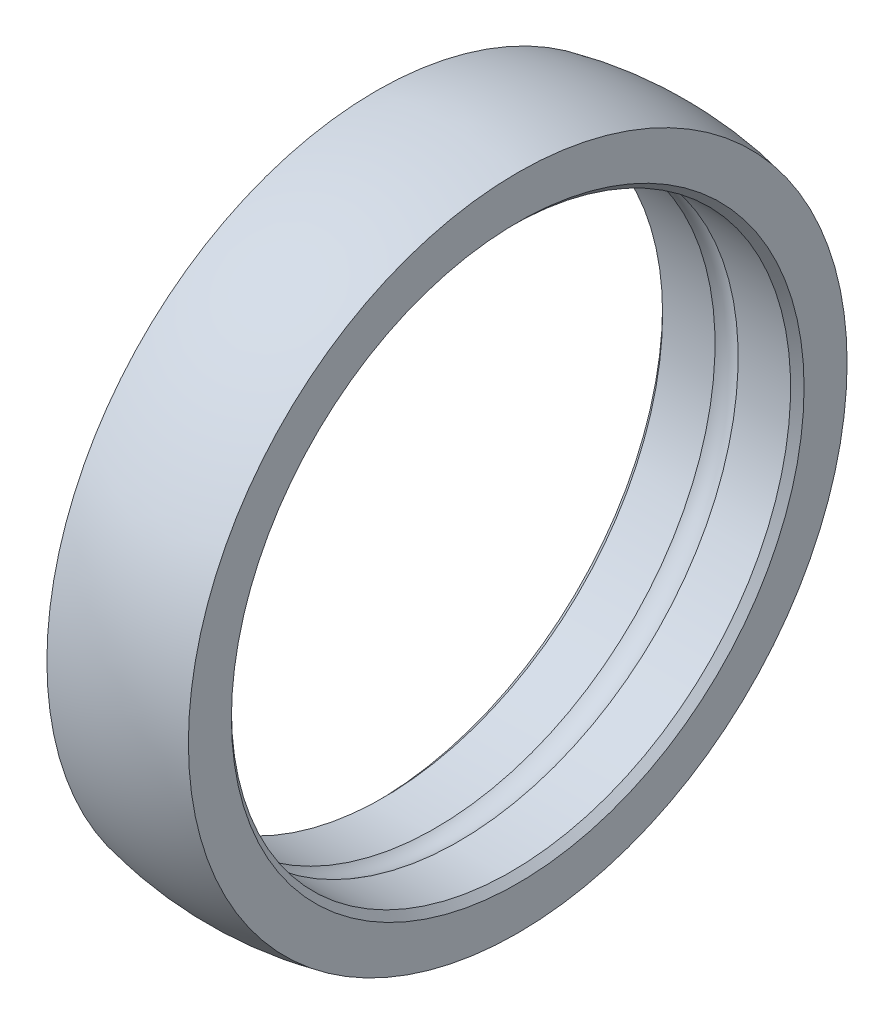
ISO-10303-21;
HEADER;
FILE_DESCRIPTION(('STEP AP214'),'2;1');
FILE_NAME('part.step','',(''),(''),'','','');
FILE_SCHEMA(('AUTOMOTIVE_DESIGN { 1 0 10303 214 1 1 1 1 }'));
ENDSEC;
DATA;
#1=APPLICATION_CONTEXT('core data for automotive mechanical design processes');
#2=APPLICATION_PROTOCOL_DEFINITION('international standard','automotive_design',2000,#1);
#3=PRODUCT_CONTEXT('',#1,'mechanical');
#4=PRODUCT('Part','Part','',(#3));
#5=PRODUCT_RELATED_PRODUCT_CATEGORY('part','',(#4));
#6=PRODUCT_DEFINITION_FORMATION('','',#4);
#7=PRODUCT_DEFINITION_CONTEXT('part definition',#1,'design');
#8=PRODUCT_DEFINITION('design','',#6,#7);
#9=PRODUCT_DEFINITION_SHAPE('','',#8);
#10=(LENGTH_UNIT() NAMED_UNIT(*) SI_UNIT(.MILLI.,.METRE.));
#11=(NAMED_UNIT(*) PLANE_ANGLE_UNIT() SI_UNIT($,.RADIAN.));
#12=(NAMED_UNIT(*) SI_UNIT($,.STERADIAN.) SOLID_ANGLE_UNIT());
#13=UNCERTAINTY_MEASURE_WITH_UNIT(LENGTH_MEASURE(1.E-05),#10,'distance_accuracy_value','');
#14=(GEOMETRIC_REPRESENTATION_CONTEXT(3) GLOBAL_UNCERTAINTY_ASSIGNED_CONTEXT((#13)) GLOBAL_UNIT_ASSIGNED_CONTEXT((#10,
#11,#12)) REPRESENTATION_CONTEXT('',''));
#15=CARTESIAN_POINT('',(0.,0.,0.));
#16=DIRECTION('',(0.,0.,1.));
#17=DIRECTION('',(1.,0.,0.));
#18=AXIS2_PLACEMENT_3D('',#15,#16,#17);
#19=CARTESIAN_POINT('',(0.,0.,0.));
#20=DIRECTION('',(-1.,0.,0.));
#21=DIRECTION('',(0.,1.,0.));
#22=AXIS2_PLACEMENT_3D('',#19,#20,#21);
#23=SPHERICAL_SURFACE('',#22,50.);
#24=CARTESIAN_POINT('',(-10.5,0.,0.));
#25=DIRECTION('',(-1.,0.,0.));
#26=DIRECTION('',(0.,0.,1.));
#27=AXIS2_PLACEMENT_3D('',#24,#25,#26);
#28=CIRCLE('',#27,48.8850692952357);
#29=CARTESIAN_POINT('',(-10.5,48.8850692952357,0.));
#30=VERTEX_POINT('',#29);
#31=EDGE_CURVE('E50',#30,#30,#28,.T.);
#32=CARTESIAN_POINT('',(10.5,0.,0.));
#33=DIRECTION('',(-1.,0.,0.));
#34=DIRECTION('',(0.,0.,1.));
#35=AXIS2_PLACEMENT_3D('',#32,#33,#34);
#36=CIRCLE('',#35,48.8850692952357);
#37=CARTESIAN_POINT('',(10.5,48.8850692952357,0.));
#38=VERTEX_POINT('',#37);
#39=EDGE_CURVE('E59',#38,#38,#36,.T.);
#40=CARTESIAN_POINT('',(-10.5,48.8850692952357,0.));
#41=CARTESIAN_POINT('',(-10.2845238395484,48.9313514073831,0.));
#42=CARTESIAN_POINT('',(-10.0687416397502,48.9762086757729,0.));
#43=CARTESIAN_POINT('',(-9.63660297161498,49.063066075458,0.));
#44=CARTESIAN_POINT('',(-9.42024650327802,49.1050662067534,0.));
#45=CARTESIAN_POINT('',(-8.98699710822005,49.1862018826703,0.));
#46=CARTESIAN_POINT('',(-8.77010418149905,49.2253374272918,0.));
#47=CARTESIAN_POINT('',(-8.33581980053706,49.3007371150384,0.));
#48=CARTESIAN_POINT('',(-8.11842834629607,49.3370012581633,0.));
#49=CARTESIAN_POINT('',(-7.68318492111956,49.406651794309,0.));
#50=CARTESIAN_POINT('',(-7.46533295018404,49.4400381873297,0.));
#51=CARTESIAN_POINT('',(-7.02920658490012,49.5039273874636,0.));
#52=CARTESIAN_POINT('',(-6.81093219055172,49.534430194577,0.));
#53=CARTESIAN_POINT('',(-6.37399914506965,49.5925468887324,0.));
#54=CARTESIAN_POINT('',(-6.15534049393597,49.6201607757745,0.));
#55=CARTESIAN_POINT('',(-5.71767716883949,49.6724948014605,0.));
#56=CARTESIAN_POINT('',(-5.49867249487669,49.6972149401044,0.));
#57=CARTESIAN_POINT('',(-5.06035541854536,49.7437571464735,0.));
#58=CARTESIAN_POINT('',(-4.84104301617683,49.7655792141987,0.));
#59=CARTESIAN_POINT('',(-4.40214883127578,49.8063214630064,0.));
#60=CARTESIAN_POINT('',(-4.18256704874326,49.8252416440888,0.));
#61=CARTESIAN_POINT('',(-3.74317249885619,49.8601768112882,0.));
#62=CARTESIAN_POINT('',(-3.52335973150165,49.876191797405,0.));
#63=CARTESIAN_POINT('',(-3.08354164770247,49.9053137743465,0.));
#64=CARTESIAN_POINT('',(-2.86353633125785,49.918420765171,0.));
#65=CARTESIAN_POINT('',(-2.42337161867875,49.9417244596828,0.));
#66=CARTESIAN_POINT('',(-2.20321222254427,49.9519211633699,0.));
#67=CARTESIAN_POINT('',(-1.76277784692764,49.9694025006451,0.));
#68=CARTESIAN_POINT('',(-1.54250286744547,49.9766871342331,0.));
#69=CARTESIAN_POINT('',(-1.10187584168612,49.988343057543,0.));
#70=CARTESIAN_POINT('',(-0.881523795408927,49.9927143472649,0.));
#71=CARTESIAN_POINT('',(-0.440781166087822,49.9985428184934,0.));
#72=CARTESIAN_POINT('',(-0.22039058304391,50.,0.));
#73=CARTESIAN_POINT('',(0.220390583043913,50.,0.));
#74=CARTESIAN_POINT('',(0.440781166087825,49.9985428184934,0.));
#75=CARTESIAN_POINT('',(0.88152379540893,49.9927143472649,0.));
#76=CARTESIAN_POINT('',(1.10187584168612,49.988343057543,0.));
#77=CARTESIAN_POINT('',(1.54250286744548,49.9766871342331,0.));
#78=CARTESIAN_POINT('',(1.76277784692764,49.9694025006451,0.));
#79=CARTESIAN_POINT('',(2.20321222254428,49.9519211633699,0.));
#80=CARTESIAN_POINT('',(2.42337161867875,49.9417244596828,0.));
#81=CARTESIAN_POINT('',(2.86353633125785,49.918420765171,0.));
#82=CARTESIAN_POINT('',(3.08354164770248,49.9053137743465,0.));
#83=CARTESIAN_POINT('',(3.52335973150165,49.876191797405,0.));
#84=CARTESIAN_POINT('',(3.74317249885619,49.8601768112882,0.));
#85=CARTESIAN_POINT('',(4.18256704874326,49.8252416440888,0.));
#86=CARTESIAN_POINT('',(4.40214883127579,49.8063214630064,0.));
#87=CARTESIAN_POINT('',(4.84104301617684,49.7655792141987,0.));
#88=CARTESIAN_POINT('',(5.06035541854536,49.7437571464735,0.));
#89=CARTESIAN_POINT('',(5.49867249487669,49.6972149401044,0.));
#90=CARTESIAN_POINT('',(5.71767716883949,49.6724948014605,0.));
#91=CARTESIAN_POINT('',(6.15534049393597,49.6201607757745,0.));
#92=CARTESIAN_POINT('',(6.37399914506965,49.5925468887324,0.));
#93=CARTESIAN_POINT('',(6.81093219055173,49.534430194577,0.));
#94=CARTESIAN_POINT('',(7.02920658490012,49.5039273874636,0.));
#95=CARTESIAN_POINT('',(7.46533295018404,49.4400381873297,0.));
#96=CARTESIAN_POINT('',(7.68318492111956,49.406651794309,0.));
#97=CARTESIAN_POINT('',(8.11842834629607,49.3370012581633,0.));
#98=CARTESIAN_POINT('',(8.33581980053707,49.3007371150384,0.));
#99=CARTESIAN_POINT('',(8.77010418149906,49.2253374272918,0.));
#100=CARTESIAN_POINT('',(8.98699710822006,49.1862018826703,0.));
#101=CARTESIAN_POINT('',(9.42024650327802,49.1050662067534,0.));
#102=CARTESIAN_POINT('',(9.63660297161498,49.063066075458,0.));
#103=CARTESIAN_POINT('',(10.0687416397502,48.9762086757729,0.));
#104=CARTESIAN_POINT('',(10.2845238395484,48.9313514073831,0.));
#105=CARTESIAN_POINT('',(10.5,48.8850692952357,0.));
#106=B_SPLINE_CURVE_WITH_KNOTS('',3,(#40,#41,#42,#43,#44,#45,#46,#47,#48,#49,#50,#51,#52,#53,
#54,#55,#56,#57,#58,#59,#60,#61,#62,#63,#64,#65,#66,#67,#68,#69,#70,#71,#72,#73,#74,#75,#76,#77,
#78,#79,#80,#81,#82,#83,#84,#85,#86,#87,#88,#89,#90,#91,#92,#93,#94,#95,#96,#97,#98,#99,#100,
#101,#102,#103,#104,#105),.UNSPECIFIED.,.F.,.F.,(4,2,2,2,2,2,2,2,2,2,2,2,2,2,2,2,2,2,2,2,2,2,2,
2,2,2,2,2,2,2,2,2,4),(0.,0.661166932088546,1.32233386417709,1.98350079626563,2.64466772835417,
3.30583466044272,3.96700159253126,4.6281685246198,5.28933545670835,5.95050238879689,
6.61166932088543,7.27283625297398,7.93400318506252,8.59517011715107,9.25633704923961,
9.91750398132815,10.5786709134167,11.2398378455052,11.9010047775938,12.5621717096823,
13.2233386417709,13.8845055738594,14.545672505948,15.2068394380365,15.868006370125,
16.5291733022136,17.1903402343021,17.8515071663907,18.5126740984792,19.1738410305678,
19.8350079626563,20.4961748947448,21.1573418268334),.UNSPECIFIED.);
#107=EDGE_CURVE('BSEAM30',#30,#38,#106,.T.);
#108=ORIENTED_EDGE('',*,*,#31,.F.);
#109=ORIENTED_EDGE('',*,*,#39,.T.);
#110=ORIENTED_EDGE('',*,*,#107,.T.);
#111=ORIENTED_EDGE('',*,*,#107,.F.);
#112=EDGE_LOOP('',(#108,#110,#109,#111));
#113=FACE_BOUND('',#112,.T.);
#114=ADVANCED_FACE('F30',(#113),#23,.T.);
#115=CARTESIAN_POINT('',(-10.5,48.8850692952357,0.));
#116=DIRECTION('',(1.,0.,0.));
#117=DIRECTION('',(0.,0.,-1.));
#118=AXIS2_PLACEMENT_3D('',#115,#116,#117);
#119=PLANE('',#118);
#120=CARTESIAN_POINT('',(-10.5,0.,0.));
#121=DIRECTION('',(1.,0.,0.));
#122=DIRECTION('',(0.,0.,-1.));
#123=AXIS2_PLACEMENT_3D('',#120,#121,#122);
#124=CIRCLE('',#123,42.5);
#125=CARTESIAN_POINT('',(-10.5,0.,-42.5));
#126=VERTEX_POINT('',#125);
#127=EDGE_CURVE('E41',#126,#126,#124,.T.);
#128=ORIENTED_EDGE('',*,*,#127,.T.);
#129=EDGE_LOOP('',(#128));
#130=FACE_BOUND('',#129,.T.);
#131=ORIENTED_EDGE('',*,*,#31,.T.);
#132=EDGE_LOOP('',(#131));
#133=FACE_BOUND('',#132,.T.);
#134=ADVANCED_FACE('F77',(#130,#133),#119,.F.);
#135=CARTESIAN_POINT('',(-55.2708439163039,0.,0.));
#136=DIRECTION('',(-1.,0.,0.));
#137=DIRECTION('',(0.,0.,1.));
#138=AXIS2_PLACEMENT_3D('',#135,#136,#137);
#139=CYLINDRICAL_SURFACE('',#138,41.5);
#140=CARTESIAN_POINT('',(-9.49999999999997,0.,0.));
#141=DIRECTION('',(1.,0.,0.));
#142=DIRECTION('',(0.,0.,-1.));
#143=AXIS2_PLACEMENT_3D('',#140,#141,#142);
#144=CIRCLE('',#143,41.5);
#145=CARTESIAN_POINT('',(-9.49999999999997,0.,-41.5));
#146=VERTEX_POINT('',#145);
#147=EDGE_CURVE('E45',#146,#146,#144,.F.);
#148=ORIENTED_EDGE('',*,*,#147,.T.);
#149=EDGE_LOOP('',(#148));
#150=FACE_BOUND('',#149,.T.);
#151=CARTESIAN_POINT('',(-1.71755640373177,0.,0.));
#152=DIRECTION('',(-1.,0.,0.));
#153=DIRECTION('',(0.,0.,1.));
#154=AXIS2_PLACEMENT_3D('',#151,#152,#153);
#155=CIRCLE('',#154,41.5);
#156=CARTESIAN_POINT('',(-1.71755640373177,0.,41.5));
#157=VERTEX_POINT('',#156);
#158=EDGE_CURVE('E53',#157,#157,#155,.T.);
#159=ORIENTED_EDGE('',*,*,#158,.F.);
#160=EDGE_LOOP('',(#159));
#161=FACE_BOUND('',#160,.T.);
#162=ADVANCED_FACE('F83',(#150,#161),#139,.F.);
#163=CARTESIAN_POINT('',(0.,0.,0.));
#164=DIRECTION('',(-1.,0.,0.));
#165=DIRECTION('',(0.,0.,1.));
#166=AXIS2_PLACEMENT_3D('',#163,#164,#165);
#167=TOROIDAL_SURFACE('',#166,38.8,3.2);
#168=CARTESIAN_POINT('',(1.71755640373177,0.,0.));
#169=DIRECTION('',(-1.,0.,0.));
#170=DIRECTION('',(0.,0.,1.));
#171=AXIS2_PLACEMENT_3D('',#168,#169,#170);
#172=CIRCLE('',#171,41.5);
#173=CARTESIAN_POINT('',(1.71755640373177,0.,41.5));
#174=VERTEX_POINT('',#173);
#175=EDGE_CURVE('E56',#174,#174,#172,.T.);
#176=ORIENTED_EDGE('',*,*,#175,.F.);
#177=EDGE_LOOP('',(#176));
#178=FACE_BOUND('',#177,.T.);
#179=ORIENTED_EDGE('',*,*,#158,.T.);
#180=EDGE_LOOP('',(#179));
#181=FACE_BOUND('',#180,.T.);
#182=ADVANCED_FACE('F74',(#178,#181),#167,.F.);
#183=CARTESIAN_POINT('',(-55.2708439163039,0.,0.));
#184=DIRECTION('',(-1.,0.,0.));
#185=DIRECTION('',(0.,0.,1.));
#186=AXIS2_PLACEMENT_3D('',#183,#184,#185);
#187=CYLINDRICAL_SURFACE('',#186,41.5);
#188=CARTESIAN_POINT('',(9.49999999999997,0.,0.));
#189=DIRECTION('',(-1.,0.,0.));
#190=DIRECTION('',(0.,0.,1.));
#191=AXIS2_PLACEMENT_3D('',#188,#189,#190);
#192=CIRCLE('',#191,41.5);
#193=CARTESIAN_POINT('',(9.49999999999997,0.,41.5));
#194=VERTEX_POINT('',#193);
#195=EDGE_CURVE('E10',#194,#194,#192,.F.);
#196=ORIENTED_EDGE('',*,*,#195,.T.);
#197=EDGE_LOOP('',(#196));
#198=FACE_BOUND('',#197,.T.);
#199=ORIENTED_EDGE('',*,*,#175,.T.);
#200=EDGE_LOOP('',(#199));
#201=FACE_BOUND('',#200,.T.);
#202=ADVANCED_FACE('F67',(#198,#201),#187,.F.);
#203=CARTESIAN_POINT('',(10.5,48.8850692952357,0.));
#204=DIRECTION('',(-1.,0.,0.));
#205=DIRECTION('',(0.,0.,1.));
#206=AXIS2_PLACEMENT_3D('',#203,#204,#205);
#207=PLANE('',#206);
#208=CARTESIAN_POINT('',(10.5,0.,0.));
#209=DIRECTION('',(-1.,0.,0.));
#210=DIRECTION('',(0.,0.,1.));
#211=AXIS2_PLACEMENT_3D('',#208,#209,#210);
#212=CIRCLE('',#211,42.5);
#213=CARTESIAN_POINT('',(10.5,0.,42.5));
#214=VERTEX_POINT('',#213);
#215=EDGE_CURVE('E37',#214,#214,#212,.T.);
#216=ORIENTED_EDGE('',*,*,#215,.T.);
#217=EDGE_LOOP('',(#216));
#218=FACE_BOUND('',#217,.T.);
#219=ORIENTED_EDGE('',*,*,#39,.F.);
#220=EDGE_LOOP('',(#219));
#221=FACE_BOUND('',#220,.T.);
#222=ADVANCED_FACE('F64',(#218,#221),#207,.F.);
#223=CARTESIAN_POINT('',(-9.49999999999997,0.,0.));
#224=DIRECTION('',(-1.,0.,0.));
#225=DIRECTION('',(0.,0.,1.));
#226=AXIS2_PLACEMENT_3D('',#223,#224,#225);
#227=CONICAL_SURFACE('',#226,41.5,0.785398163397448);
#228=ORIENTED_EDGE('',*,*,#127,.F.);
#229=EDGE_LOOP('',(#228));
#230=FACE_BOUND('',#229,.T.);
#231=ORIENTED_EDGE('',*,*,#147,.F.);
#232=EDGE_LOOP('',(#231));
#233=FACE_BOUND('',#232,.T.);
#234=ADVANCED_FACE('F66',(#230,#233),#227,.F.);
#235=CARTESIAN_POINT('',(10.5,0.,0.));
#236=DIRECTION('',(1.,0.,0.));
#237=DIRECTION('',(0.,0.,-1.));
#238=AXIS2_PLACEMENT_3D('',#235,#236,#237);
#239=CONICAL_SURFACE('',#238,42.5,0.785398163397445);
#240=ORIENTED_EDGE('',*,*,#195,.F.);
#241=EDGE_LOOP('',(#240));
#242=FACE_BOUND('',#241,.T.);
#243=ORIENTED_EDGE('',*,*,#215,.F.);
#244=EDGE_LOOP('',(#243));
#245=FACE_BOUND('',#244,.T.);
#246=ADVANCED_FACE('F32',(#242,#245),#239,.F.);
#247=CLOSED_SHELL('',(#114,#134,#162,#182,#202,#222,#234,#246));
#248=MANIFOLD_SOLID_BREP('B2',#247);
#249=ADVANCED_BREP_SHAPE_REPRESENTATION('',(#18,#248),#14);
#250=SHAPE_DEFINITION_REPRESENTATION(#9,#249);
ENDSEC;
END-ISO-10303-21;
